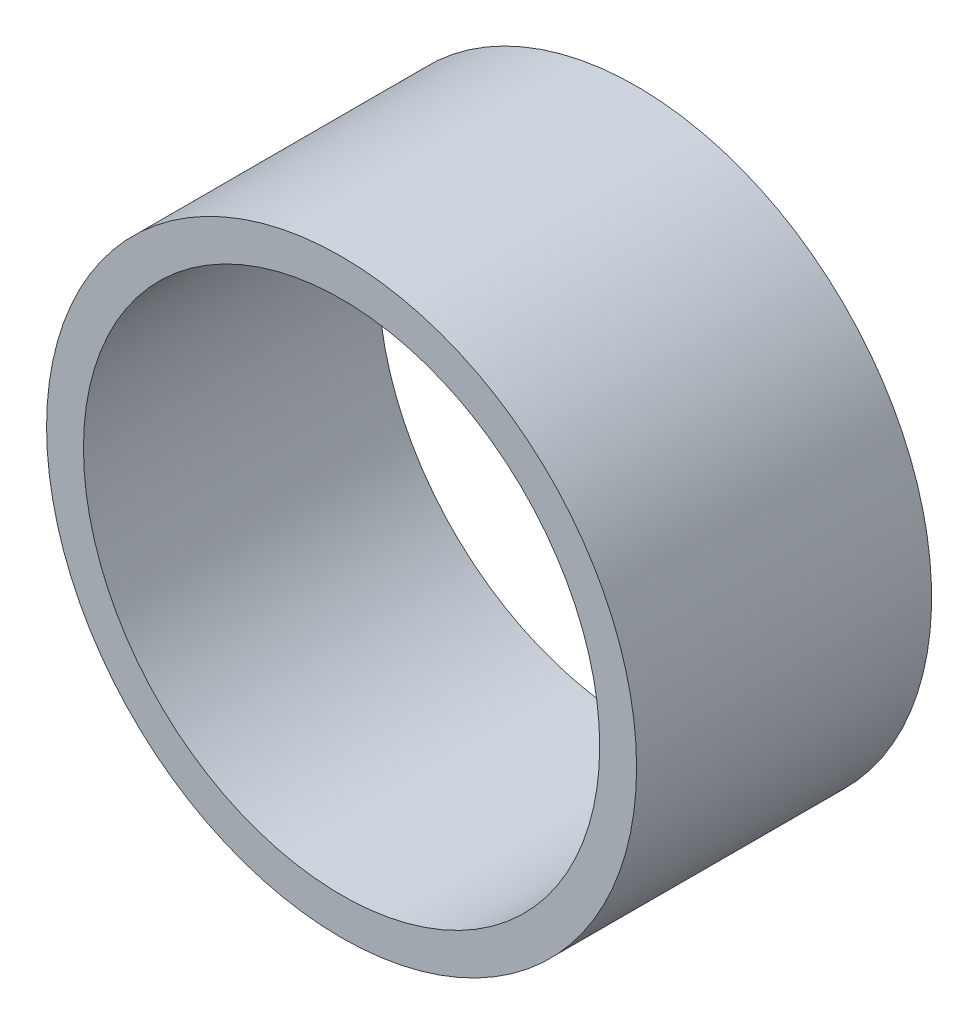
ISO-10303-21;
HEADER;
FILE_DESCRIPTION(('STEP AP214'),'2;1');
FILE_NAME('part.step','',(''),(''),'','','');
FILE_SCHEMA(('AUTOMOTIVE_DESIGN { 1 0 10303 214 1 1 1 1 }'));
ENDSEC;
DATA;
#1=APPLICATION_CONTEXT('core data for automotive mechanical design processes');
#2=APPLICATION_PROTOCOL_DEFINITION('international standard','automotive_design',2000,#1);
#3=PRODUCT_CONTEXT('',#1,'mechanical');
#4=PRODUCT('Part','Part','',(#3));
#5=PRODUCT_RELATED_PRODUCT_CATEGORY('part','',(#4));
#6=PRODUCT_DEFINITION_FORMATION('','',#4);
#7=PRODUCT_DEFINITION_CONTEXT('part definition',#1,'design');
#8=PRODUCT_DEFINITION('design','',#6,#7);
#9=PRODUCT_DEFINITION_SHAPE('','',#8);
#10=(LENGTH_UNIT() NAMED_UNIT(*) SI_UNIT(.MILLI.,.METRE.));
#11=(NAMED_UNIT(*) PLANE_ANGLE_UNIT() SI_UNIT($,.RADIAN.));
#12=(NAMED_UNIT(*) SI_UNIT($,.STERADIAN.) SOLID_ANGLE_UNIT());
#13=UNCERTAINTY_MEASURE_WITH_UNIT(LENGTH_MEASURE(1.E-05),#10,'distance_accuracy_value','');
#14=(GEOMETRIC_REPRESENTATION_CONTEXT(3) GLOBAL_UNCERTAINTY_ASSIGNED_CONTEXT((#13)) GLOBAL_UNIT_ASSIGNED_CONTEXT((#10,
#11,#12)) REPRESENTATION_CONTEXT('',''));
#15=CARTESIAN_POINT('',(0.,0.,0.));
#16=DIRECTION('',(0.,0.,1.));
#17=DIRECTION('',(1.,0.,0.));
#18=AXIS2_PLACEMENT_3D('',#15,#16,#17);
#19=CARTESIAN_POINT('',(0.,0.,457.2));
#20=DIRECTION('',(0.,0.,-1.));
#21=DIRECTION('',(-1.,0.,0.));
#22=AXIS2_PLACEMENT_3D('',#19,#20,#21);
#23=CYLINDRICAL_SURFACE('',#22,12.7);
#24=CARTESIAN_POINT('',(0.,0.,457.2));
#25=DIRECTION('',(0.,0.,1.));
#26=DIRECTION('',(1.,0.,0.));
#27=AXIS2_PLACEMENT_3D('',#24,#25,#26);
#28=CIRCLE('',#27,12.7);
#29=CARTESIAN_POINT('',(12.7,0.,457.2));
#30=VERTEX_POINT('',#29);
#31=EDGE_CURVE('E10',#30,#30,#28,.T.);
#32=ORIENTED_EDGE('',*,*,#31,.F.);
#33=EDGE_LOOP('',(#32));
#34=FACE_BOUND('',#33,.T.);
#35=CARTESIAN_POINT('',(0.,0.,444.5));
#36=DIRECTION('',(0.,0.,-1.));
#37=DIRECTION('',(-1.,0.,0.));
#38=AXIS2_PLACEMENT_3D('',#35,#36,#37);
#39=CIRCLE('',#38,12.7);
#40=CARTESIAN_POINT('',(-12.7,0.,444.5));
#41=VERTEX_POINT('',#40);
#42=EDGE_CURVE('E42',#41,#41,#39,.T.);
#43=ORIENTED_EDGE('',*,*,#42,.F.);
#44=EDGE_LOOP('',(#43));
#45=FACE_BOUND('',#44,.T.);
#46=ADVANCED_FACE('F31',(#34,#45),#23,.T.);
#47=CARTESIAN_POINT('',(0.,0.,457.2));
#48=DIRECTION('',(0.,0.,-1.));
#49=DIRECTION('',(-1.,0.,0.));
#50=AXIS2_PLACEMENT_3D('',#47,#48,#49);
#51=CYLINDRICAL_SURFACE('',#50,11.1125);
#52=CARTESIAN_POINT('',(0.,0.,457.2));
#53=DIRECTION('',(0.,0.,1.));
#54=DIRECTION('',(1.,0.,0.));
#55=AXIS2_PLACEMENT_3D('',#52,#53,#54);
#56=CIRCLE('',#55,11.1125);
#57=CARTESIAN_POINT('',(11.1125,0.,457.2));
#58=VERTEX_POINT('',#57);
#59=EDGE_CURVE('E38',#58,#58,#56,.T.);
#60=ORIENTED_EDGE('',*,*,#59,.T.);
#61=EDGE_LOOP('',(#60));
#62=FACE_BOUND('',#61,.T.);
#63=CARTESIAN_POINT('',(0.,0.,444.5));
#64=DIRECTION('',(0.,0.,-1.));
#65=DIRECTION('',(-1.,0.,0.));
#66=AXIS2_PLACEMENT_3D('',#63,#64,#65);
#67=CIRCLE('',#66,11.1125);
#68=CARTESIAN_POINT('',(-11.1125,0.,444.5));
#69=VERTEX_POINT('',#68);
#70=EDGE_CURVE('E34',#69,#69,#67,.T.);
#71=ORIENTED_EDGE('',*,*,#70,.T.);
#72=EDGE_LOOP('',(#71));
#73=FACE_BOUND('',#72,.T.);
#74=ADVANCED_FACE('F51',(#62,#73),#51,.F.);
#75=CARTESIAN_POINT('',(0.,0.,457.2));
#76=DIRECTION('',(0.,0.,1.));
#77=DIRECTION('',(1.,0.,0.));
#78=AXIS2_PLACEMENT_3D('',#75,#76,#77);
#79=PLANE('',#78);
#80=ORIENTED_EDGE('',*,*,#31,.T.);
#81=EDGE_LOOP('',(#80));
#82=FACE_BOUND('',#81,.T.);
#83=ORIENTED_EDGE('',*,*,#59,.F.);
#84=EDGE_LOOP('',(#83));
#85=FACE_BOUND('',#84,.T.);
#86=ADVANCED_FACE('F55',(#82,#85),#79,.T.);
#87=CARTESIAN_POINT('',(-123.688086975335,25.4,444.5));
#88=DIRECTION('',(0.,0.,-1.));
#89=DIRECTION('',(-1.,0.,0.));
#90=AXIS2_PLACEMENT_3D('',#87,#88,#89);
#91=PLANE('',#90);
#92=ORIENTED_EDGE('',*,*,#70,.F.);
#93=EDGE_LOOP('',(#92));
#94=FACE_BOUND('',#93,.T.);
#95=ORIENTED_EDGE('',*,*,#42,.T.);
#96=EDGE_LOOP('',(#95));
#97=FACE_BOUND('',#96,.T.);
#98=ADVANCED_FACE('F53',(#94,#97),#91,.T.);
#99=CLOSED_SHELL('',(#46,#74,#86,#98));
#100=MANIFOLD_SOLID_BREP('B2',#99);
#101=ADVANCED_BREP_SHAPE_REPRESENTATION('',(#18,#100),#14);
#102=SHAPE_DEFINITION_REPRESENTATION(#9,#101);
ENDSEC;
END-ISO-10303-21;
